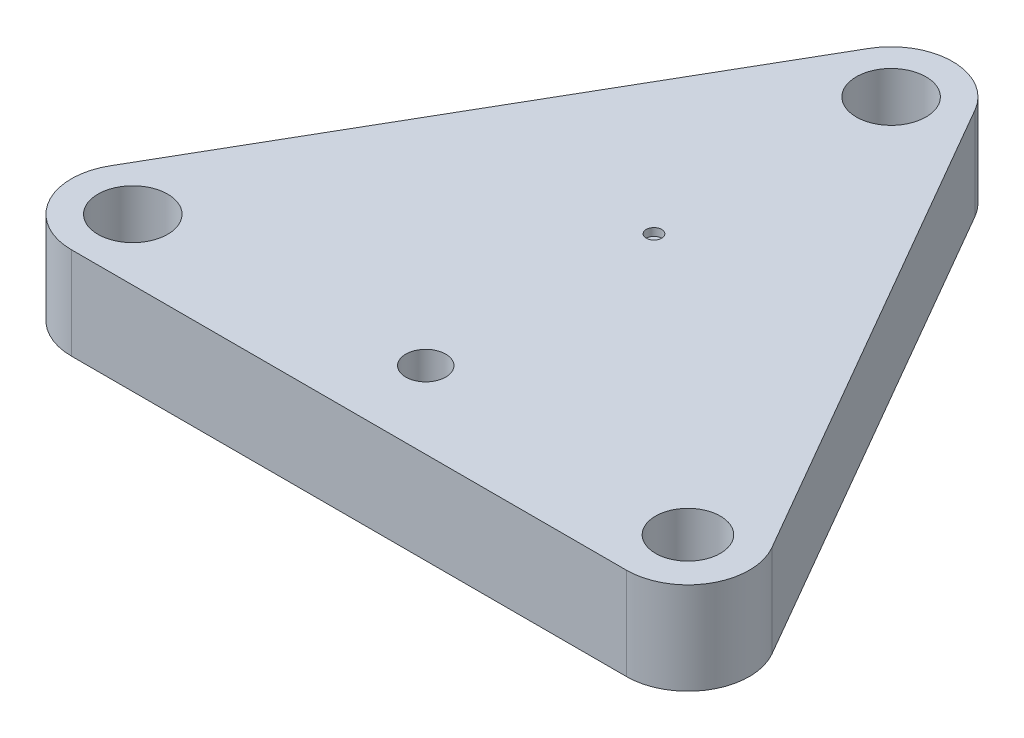
ISO-10303-21;
HEADER;
FILE_DESCRIPTION(('STEP AP214'),'2;1');
FILE_NAME('part.step','',(''),(''),'','','');
FILE_SCHEMA(('AUTOMOTIVE_DESIGN { 1 0 10303 214 1 1 1 1 }'));
ENDSEC;
DATA;
#1=APPLICATION_CONTEXT('core data for automotive mechanical design processes');
#2=APPLICATION_PROTOCOL_DEFINITION('international standard','automotive_design',2000,#1);
#3=PRODUCT_CONTEXT('',#1,'mechanical');
#4=PRODUCT('Part','Part','',(#3));
#5=PRODUCT_RELATED_PRODUCT_CATEGORY('part','',(#4));
#6=PRODUCT_DEFINITION_FORMATION('','',#4);
#7=PRODUCT_DEFINITION_CONTEXT('part definition',#1,'design');
#8=PRODUCT_DEFINITION('design','',#6,#7);
#9=PRODUCT_DEFINITION_SHAPE('','',#8);
#10=(LENGTH_UNIT() NAMED_UNIT(*) SI_UNIT(.MILLI.,.METRE.));
#11=(NAMED_UNIT(*) PLANE_ANGLE_UNIT() SI_UNIT($,.RADIAN.));
#12=(NAMED_UNIT(*) SI_UNIT($,.STERADIAN.) SOLID_ANGLE_UNIT());
#13=UNCERTAINTY_MEASURE_WITH_UNIT(LENGTH_MEASURE(1.E-05),#10,'distance_accuracy_value','');
#14=(GEOMETRIC_REPRESENTATION_CONTEXT(3) GLOBAL_UNCERTAINTY_ASSIGNED_CONTEXT((#13)) GLOBAL_UNIT_ASSIGNED_CONTEXT((#10,
#11,#12)) REPRESENTATION_CONTEXT('',''));
#15=CARTESIAN_POINT('',(0.,0.,0.));
#16=DIRECTION('',(0.,0.,1.));
#17=DIRECTION('',(1.,0.,0.));
#18=AXIS2_PLACEMENT_3D('',#15,#16,#17);
#19=CARTESIAN_POINT('',(9.0358983848623,3.,-2.));
#20=DIRECTION('',(0.,1.,0.));
#21=DIRECTION('',(0.,0.,1.));
#22=AXIS2_PLACEMENT_3D('',#19,#20,#21);
#23=PLANE('',#22);
#24=CARTESIAN_POINT('',(0.,3.,-9.93044291847072));
#25=DIRECTION('',(0.,1.,0.));
#26=DIRECTION('',(0.,0.,1.));
#27=AXIS2_PLACEMENT_3D('',#24,#25,#26);
#28=CIRCLE('',#27,0.25);
#29=CARTESIAN_POINT('',(0.,3.,-9.68044291847072));
#30=VERTEX_POINT('',#29);
#31=EDGE_CURVE('E171',#30,#30,#28,.T.);
#32=ORIENTED_EDGE('',*,*,#31,.F.);
#33=EDGE_LOOP('',(#32));
#34=FACE_BOUND('',#33,.T.);
#35=CARTESIAN_POINT('',(-4.89712808370489E-13,3.,-2.5));
#36=DIRECTION('',(0.,1.,0.));
#37=DIRECTION('',(0.,0.,1.));
#38=AXIS2_PLACEMENT_3D('',#35,#36,#37);
#39=CIRCLE('',#38,0.65);
#40=CARTESIAN_POINT('',(-4.89712808370489E-13,3.,-1.85));
#41=VERTEX_POINT('',#40);
#42=EDGE_CURVE('E165',#41,#41,#39,.T.);
#43=ORIENTED_EDGE('',*,*,#42,.F.);
#44=EDGE_LOOP('',(#43));
#45=FACE_BOUND('',#44,.T.);
#46=CARTESIAN_POINT('',(-9.03589838486223,3.,-2.));
#47=DIRECTION('',(0.,1.,0.));
#48=DIRECTION('',(0.,0.,1.));
#49=AXIS2_PLACEMENT_3D('',#46,#47,#48);
#50=CIRCLE('',#49,1.135);
#51=CARTESIAN_POINT('',(-9.03589838486223,3.,-0.864999999999998));
#52=VERTEX_POINT('',#51);
#53=EDGE_CURVE('E150',#52,#52,#50,.T.);
#54=ORIENTED_EDGE('',*,*,#53,.F.);
#55=EDGE_LOOP('',(#54));
#56=FACE_BOUND('',#55,.T.);
#57=DIRECTION('',(1.,0.,0.));
#58=VECTOR('',#57,1.);
#59=CARTESIAN_POINT('',(-9.03589838486223,3.,0.));
#60=LINE('',#59,#58);
#61=CARTESIAN_POINT('',(-9.03589838486223,3.,0.));
#62=VERTEX_POINT('',#61);
#63=CARTESIAN_POINT('',(9.03589838486229,3.,0.));
#64=VERTEX_POINT('',#63);
#65=EDGE_CURVE('E86',#62,#64,#60,.T.);
#66=ORIENTED_EDGE('',*,*,#65,.T.);
#67=CARTESIAN_POINT('',(9.0358983848623,3.,-2.));
#68=DIRECTION('',(0.,1.,0.));
#69=DIRECTION('',(0.,0.,1.));
#70=AXIS2_PLACEMENT_3D('',#67,#68,#69);
#71=CIRCLE('',#70,2.);
#72=CARTESIAN_POINT('',(10.7679491924312,3.,-2.99999999999998));
#73=VERTEX_POINT('',#72);
#74=EDGE_CURVE('E143',#64,#73,#71,.T.);
#75=ORIENTED_EDGE('',*,*,#74,.T.);
#76=DIRECTION('',(-0.499999999999991,0.,-0.866025403784444));
#77=VECTOR('',#76,1.);
#78=CARTESIAN_POINT('',(10.7679491924312,3.,-2.99999999999998));
#79=LINE('',#78,#77);
#80=CARTESIAN_POINT('',(1.73205080756907,3.,-18.6506350946111));
#81=VERTEX_POINT('',#80);
#82=EDGE_CURVE('E100',#73,#81,#79,.T.);
#83=ORIENTED_EDGE('',*,*,#82,.T.);
#84=CARTESIAN_POINT('',(1.90824453591173E-13,3.,-17.6506350946111));
#85=DIRECTION('',(0.,1.,0.));
#86=DIRECTION('',(0.,0.,1.));
#87=AXIS2_PLACEMENT_3D('',#84,#85,#86);
#88=CIRCLE('',#87,2.);
#89=CARTESIAN_POINT('',(-1.73205080756868,3.,-18.6506350946111));
#90=VERTEX_POINT('',#89);
#91=EDGE_CURVE('E94',#81,#90,#88,.T.);
#92=ORIENTED_EDGE('',*,*,#91,.T.);
#93=DIRECTION('',(-0.500000000000004,0.,0.866025403784436));
#94=VECTOR('',#93,1.);
#95=CARTESIAN_POINT('',(-1.73205080756869,3.,-18.6506350946111));
#96=LINE('',#95,#94);
#97=CARTESIAN_POINT('',(-10.7679491924311,3.,-3.00000000000001));
#98=VERTEX_POINT('',#97);
#99=EDGE_CURVE('E98',#90,#98,#96,.T.);
#100=ORIENTED_EDGE('',*,*,#99,.T.);
#101=CARTESIAN_POINT('',(-9.03589838486223,3.,-2.));
#102=DIRECTION('',(0.,1.,0.));
#103=DIRECTION('',(0.,0.,1.));
#104=AXIS2_PLACEMENT_3D('',#101,#102,#103);
#105=CIRCLE('',#104,2.);
#106=EDGE_CURVE('E50',#98,#62,#105,.T.);
#107=ORIENTED_EDGE('',*,*,#106,.T.);
#108=EDGE_LOOP('',(#66,#75,#83,#92,#100,#107));
#109=FACE_BOUND('',#108,.T.);
#110=CARTESIAN_POINT('',(1.90824453591173E-13,3.,-17.6506350946111));
#111=DIRECTION('',(0.,1.,0.));
#112=DIRECTION('',(0.,0.,1.));
#113=AXIS2_PLACEMENT_3D('',#110,#111,#112);
#114=CIRCLE('',#113,1.135);
#115=CARTESIAN_POINT('',(1.90824453591173E-13,3.,-16.5156350946111));
#116=VERTEX_POINT('',#115);
#117=EDGE_CURVE('E120',#116,#116,#114,.T.);
#118=ORIENTED_EDGE('',*,*,#117,.F.);
#119=EDGE_LOOP('',(#118));
#120=FACE_BOUND('',#119,.T.);
#121=CARTESIAN_POINT('',(9.0358983848623,3.,-2.));
#122=DIRECTION('',(0.,1.,0.));
#123=DIRECTION('',(0.,0.,1.));
#124=AXIS2_PLACEMENT_3D('',#121,#122,#123);
#125=CIRCLE('',#124,1.054);
#126=CARTESIAN_POINT('',(9.0358983848623,3.,-0.946));
#127=VERTEX_POINT('',#126);
#128=EDGE_CURVE('E156',#127,#127,#125,.T.);
#129=ORIENTED_EDGE('',*,*,#128,.F.);
#130=EDGE_LOOP('',(#129));
#131=FACE_BOUND('',#130,.T.);
#132=ADVANCED_FACE('F33',(#34,#45,#56,#109,#120,#131),#23,.T.);
#133=CARTESIAN_POINT('',(9.0358983848623,0.,-2.));
#134=DIRECTION('',(0.,1.,0.));
#135=DIRECTION('',(0.,0.,1.));
#136=AXIS2_PLACEMENT_3D('',#133,#134,#135);
#137=PLANE('',#136);
#138=CARTESIAN_POINT('',(-4.89712808370489E-13,0.,-2.5));
#139=DIRECTION('',(0.,1.,0.));
#140=DIRECTION('',(0.,0.,1.));
#141=AXIS2_PLACEMENT_3D('',#138,#139,#140);
#142=CIRCLE('',#141,0.65);
#143=CARTESIAN_POINT('',(-4.89712808370489E-13,0.,-1.85));
#144=VERTEX_POINT('',#143);
#145=EDGE_CURVE('E162',#144,#144,#142,.T.);
#146=ORIENTED_EDGE('',*,*,#145,.T.);
#147=EDGE_LOOP('',(#146));
#148=FACE_BOUND('',#147,.T.);
#149=CARTESIAN_POINT('',(-9.03589838486223,0.,-2.));
#150=DIRECTION('',(0.,1.,0.));
#151=DIRECTION('',(0.,0.,1.));
#152=AXIS2_PLACEMENT_3D('',#149,#150,#151);
#153=CIRCLE('',#152,1.135);
#154=CARTESIAN_POINT('',(-9.03589838486223,0.,-0.864999999999998));
#155=VERTEX_POINT('',#154);
#156=EDGE_CURVE('E153',#155,#155,#153,.T.);
#157=ORIENTED_EDGE('',*,*,#156,.T.);
#158=EDGE_LOOP('',(#157));
#159=FACE_BOUND('',#158,.T.);
#160=DIRECTION('',(1.,0.,0.));
#161=VECTOR('',#160,1.);
#162=CARTESIAN_POINT('',(0.,0.,0.));
#163=LINE('',#162,#161);
#164=CARTESIAN_POINT('',(-9.03589838486223,0.,0.));
#165=VERTEX_POINT('',#164);
#166=CARTESIAN_POINT('',(9.03589838486229,0.,0.));
#167=VERTEX_POINT('',#166);
#168=EDGE_CURVE('E80',#165,#167,#163,.T.);
#169=ORIENTED_EDGE('',*,*,#168,.F.);
#170=CARTESIAN_POINT('',(-9.03589838486223,0.,-2.));
#171=DIRECTION('',(0.,1.,0.));
#172=DIRECTION('',(0.,0.,1.));
#173=AXIS2_PLACEMENT_3D('',#170,#171,#172);
#174=CIRCLE('',#173,2.);
#175=CARTESIAN_POINT('',(-10.7679491924311,0.,-3.00000000000001));
#176=VERTEX_POINT('',#175);
#177=EDGE_CURVE('E126',#176,#165,#174,.T.);
#178=ORIENTED_EDGE('',*,*,#177,.F.);
#179=DIRECTION('',(-0.500000000000004,0.,0.866025403784436));
#180=VECTOR('',#179,1.);
#181=CARTESIAN_POINT('',(-1.73205080756869,0.,-18.6506350946111));
#182=LINE('',#181,#180);
#183=CARTESIAN_POINT('',(-1.73205080756868,0.,-18.6506350946111));
#184=VERTEX_POINT('',#183);
#185=EDGE_CURVE('E73',#184,#176,#182,.T.);
#186=ORIENTED_EDGE('',*,*,#185,.F.);
#187=CARTESIAN_POINT('',(1.90824453591173E-13,0.,-17.6506350946111));
#188=DIRECTION('',(0.,1.,0.));
#189=DIRECTION('',(0.,0.,1.));
#190=AXIS2_PLACEMENT_3D('',#187,#188,#189);
#191=CIRCLE('',#190,2.);
#192=CARTESIAN_POINT('',(1.73205080756907,0.,-18.6506350946111));
#193=VERTEX_POINT('',#192);
#194=EDGE_CURVE('E108',#193,#184,#191,.T.);
#195=ORIENTED_EDGE('',*,*,#194,.F.);
#196=DIRECTION('',(-0.499999999999991,0.,-0.866025403784444));
#197=VECTOR('',#196,1.);
#198=CARTESIAN_POINT('',(10.7679491924312,0.,-2.99999999999998));
#199=LINE('',#198,#197);
#200=CARTESIAN_POINT('',(10.7679491924312,0.,-2.99999999999998));
#201=VERTEX_POINT('',#200);
#202=EDGE_CURVE('E122',#201,#193,#199,.T.);
#203=ORIENTED_EDGE('',*,*,#202,.F.);
#204=CARTESIAN_POINT('',(9.0358983848623,0.,-2.));
#205=DIRECTION('',(0.,1.,0.));
#206=DIRECTION('',(0.,0.,1.));
#207=AXIS2_PLACEMENT_3D('',#204,#205,#206);
#208=CIRCLE('',#207,2.);
#209=EDGE_CURVE('E119',#167,#201,#208,.T.);
#210=ORIENTED_EDGE('',*,*,#209,.F.);
#211=EDGE_LOOP('',(#169,#178,#186,#195,#203,#210));
#212=FACE_BOUND('',#211,.T.);
#213=CARTESIAN_POINT('',(1.90824453591173E-13,0.,-17.6506350946111));
#214=DIRECTION('',(0.,1.,0.));
#215=DIRECTION('',(0.,0.,1.));
#216=AXIS2_PLACEMENT_3D('',#213,#214,#215);
#217=CIRCLE('',#216,1.135);
#218=CARTESIAN_POINT('',(1.90824453591173E-13,0.,-16.5156350946111));
#219=VERTEX_POINT('',#218);
#220=EDGE_CURVE('E147',#219,#219,#217,.T.);
#221=ORIENTED_EDGE('',*,*,#220,.T.);
#222=EDGE_LOOP('',(#221));
#223=FACE_BOUND('',#222,.T.);
#224=CARTESIAN_POINT('',(9.0358983848623,0.,-2.));
#225=DIRECTION('',(0.,1.,0.));
#226=DIRECTION('',(0.,0.,1.));
#227=AXIS2_PLACEMENT_3D('',#224,#225,#226);
#228=CIRCLE('',#227,1.054);
#229=CARTESIAN_POINT('',(9.0358983848623,0.,-0.946));
#230=VERTEX_POINT('',#229);
#231=EDGE_CURVE('E159',#230,#230,#228,.T.);
#232=ORIENTED_EDGE('',*,*,#231,.T.);
#233=EDGE_LOOP('',(#232));
#234=FACE_BOUND('',#233,.T.);
#235=ADVANCED_FACE('F138',(#148,#159,#212,#223,#234),#137,.F.);
#236=CARTESIAN_POINT('',(0.,3.,0.));
#237=DIRECTION('',(0.,0.,-1.));
#238=DIRECTION('',(-1.,0.,0.));
#239=AXIS2_PLACEMENT_3D('',#236,#237,#238);
#240=PLANE('',#239);
#241=ORIENTED_EDGE('',*,*,#168,.T.);
#242=DIRECTION('',(0.,-1.,0.));
#243=VECTOR('',#242,1.);
#244=CARTESIAN_POINT('',(9.03589838486229,3.,0.));
#245=LINE('',#244,#243);
#246=EDGE_CURVE('E11',#64,#167,#245,.T.);
#247=ORIENTED_EDGE('',*,*,#246,.F.);
#248=ORIENTED_EDGE('',*,*,#65,.F.);
#249=DIRECTION('',(0.,-1.,0.));
#250=VECTOR('',#249,1.);
#251=CARTESIAN_POINT('',(-9.03589838486223,3.,0.));
#252=LINE('',#251,#250);
#253=EDGE_CURVE('E114',#62,#165,#252,.T.);
#254=ORIENTED_EDGE('',*,*,#253,.T.);
#255=EDGE_LOOP('',(#241,#247,#248,#254));
#256=FACE_BOUND('',#255,.T.);
#257=ADVANCED_FACE('F35',(#256),#240,.F.);
#258=CARTESIAN_POINT('',(9.0358983848623,3.,-2.));
#259=DIRECTION('',(0.,-1.,0.));
#260=DIRECTION('',(0.,0.,-1.));
#261=AXIS2_PLACEMENT_3D('',#258,#259,#260);
#262=CYLINDRICAL_SURFACE('',#261,2.);
#263=ORIENTED_EDGE('',*,*,#209,.T.);
#264=DIRECTION('',(0.,-1.,0.));
#265=VECTOR('',#264,1.);
#266=CARTESIAN_POINT('',(10.7679491924312,3.,-2.99999999999998));
#267=LINE('',#266,#265);
#268=EDGE_CURVE('E42',#73,#201,#267,.T.);
#269=ORIENTED_EDGE('',*,*,#268,.F.);
#270=ORIENTED_EDGE('',*,*,#74,.F.);
#271=ORIENTED_EDGE('',*,*,#246,.T.);
#272=EDGE_LOOP('',(#263,#269,#270,#271));
#273=FACE_BOUND('',#272,.T.);
#274=ADVANCED_FACE('F207',(#273),#262,.T.);
#275=CARTESIAN_POINT('',(10.7679491924312,3.,-2.99999999999998));
#276=DIRECTION('',(-0.866025403784444,0.,0.499999999999991));
#277=DIRECTION('',(0.499999999999991,0.,0.866025403784444));
#278=AXIS2_PLACEMENT_3D('',#275,#276,#277);
#279=PLANE('',#278);
#280=ORIENTED_EDGE('',*,*,#202,.T.);
#281=DIRECTION('',(0.,-1.,0.));
#282=VECTOR('',#281,1.);
#283=CARTESIAN_POINT('',(1.73205080756907,3.,-18.6506350946111));
#284=LINE('',#283,#282);
#285=EDGE_CURVE('E109',#81,#193,#284,.T.);
#286=ORIENTED_EDGE('',*,*,#285,.F.);
#287=ORIENTED_EDGE('',*,*,#82,.F.);
#288=ORIENTED_EDGE('',*,*,#268,.T.);
#289=EDGE_LOOP('',(#280,#286,#287,#288));
#290=FACE_BOUND('',#289,.T.);
#291=ADVANCED_FACE('F135',(#290),#279,.F.);
#292=CARTESIAN_POINT('',(1.90824453591173E-13,3.,-17.6506350946111));
#293=DIRECTION('',(0.,-1.,0.));
#294=DIRECTION('',(0.,0.,-1.));
#295=AXIS2_PLACEMENT_3D('',#292,#293,#294);
#296=CYLINDRICAL_SURFACE('',#295,2.);
#297=ORIENTED_EDGE('',*,*,#194,.T.);
#298=DIRECTION('',(0.,-1.,0.));
#299=VECTOR('',#298,1.);
#300=CARTESIAN_POINT('',(-1.73205080756868,3.,-18.6506350946111));
#301=LINE('',#300,#299);
#302=EDGE_CURVE('E105',#90,#184,#301,.T.);
#303=ORIENTED_EDGE('',*,*,#302,.F.);
#304=ORIENTED_EDGE('',*,*,#91,.F.);
#305=ORIENTED_EDGE('',*,*,#285,.T.);
#306=EDGE_LOOP('',(#297,#303,#304,#305));
#307=FACE_BOUND('',#306,.T.);
#308=ADVANCED_FACE('F106',(#307),#296,.T.);
#309=CARTESIAN_POINT('',(-1.73205080756869,3.,-18.6506350946111));
#310=DIRECTION('',(0.866025403784436,0.,0.500000000000004));
#311=DIRECTION('',(0.500000000000004,0.,-0.866025403784436));
#312=AXIS2_PLACEMENT_3D('',#309,#310,#311);
#313=PLANE('',#312);
#314=ORIENTED_EDGE('',*,*,#185,.T.);
#315=DIRECTION('',(0.,-1.,0.));
#316=VECTOR('',#315,1.);
#317=CARTESIAN_POINT('',(-10.7679491924311,3.,-3.00000000000001));
#318=LINE('',#317,#316);
#319=EDGE_CURVE('E110',#98,#176,#318,.T.);
#320=ORIENTED_EDGE('',*,*,#319,.F.);
#321=ORIENTED_EDGE('',*,*,#99,.F.);
#322=ORIENTED_EDGE('',*,*,#302,.T.);
#323=EDGE_LOOP('',(#314,#320,#321,#322));
#324=FACE_BOUND('',#323,.T.);
#325=ADVANCED_FACE('F112',(#324),#313,.F.);
#326=CARTESIAN_POINT('',(-9.03589838486223,3.,-2.));
#327=DIRECTION('',(0.,-1.,0.));
#328=DIRECTION('',(0.,0.,-1.));
#329=AXIS2_PLACEMENT_3D('',#326,#327,#328);
#330=CYLINDRICAL_SURFACE('',#329,2.);
#331=ORIENTED_EDGE('',*,*,#177,.T.);
#332=ORIENTED_EDGE('',*,*,#253,.F.);
#333=ORIENTED_EDGE('',*,*,#106,.F.);
#334=ORIENTED_EDGE('',*,*,#319,.T.);
#335=EDGE_LOOP('',(#331,#332,#333,#334));
#336=FACE_BOUND('',#335,.T.);
#337=ADVANCED_FACE('F141',(#336),#330,.T.);
#338=CARTESIAN_POINT('',(1.90824453591173E-13,3.,-17.6506350946111));
#339=DIRECTION('',(0.,-1.,0.));
#340=DIRECTION('',(0.,0.,-1.));
#341=AXIS2_PLACEMENT_3D('',#338,#339,#340);
#342=CYLINDRICAL_SURFACE('',#341,1.135);
#343=ORIENTED_EDGE('',*,*,#117,.T.);
#344=EDGE_LOOP('',(#343));
#345=FACE_BOUND('',#344,.T.);
#346=ORIENTED_EDGE('',*,*,#220,.F.);
#347=EDGE_LOOP('',(#346));
#348=FACE_BOUND('',#347,.T.);
#349=ADVANCED_FACE('F197',(#345,#348),#342,.F.);
#350=CARTESIAN_POINT('',(-9.03589838486223,3.,-2.));
#351=DIRECTION('',(0.,-1.,0.));
#352=DIRECTION('',(0.,0.,-1.));
#353=AXIS2_PLACEMENT_3D('',#350,#351,#352);
#354=CYLINDRICAL_SURFACE('',#353,1.135);
#355=ORIENTED_EDGE('',*,*,#53,.T.);
#356=EDGE_LOOP('',(#355));
#357=FACE_BOUND('',#356,.T.);
#358=ORIENTED_EDGE('',*,*,#156,.F.);
#359=EDGE_LOOP('',(#358));
#360=FACE_BOUND('',#359,.T.);
#361=ADVANCED_FACE('F193',(#357,#360),#354,.F.);
#362=CARTESIAN_POINT('',(9.0358983848623,3.,-2.));
#363=DIRECTION('',(0.,-1.,0.));
#364=DIRECTION('',(0.,0.,-1.));
#365=AXIS2_PLACEMENT_3D('',#362,#363,#364);
#366=CYLINDRICAL_SURFACE('',#365,1.054);
#367=ORIENTED_EDGE('',*,*,#128,.T.);
#368=EDGE_LOOP('',(#367));
#369=FACE_BOUND('',#368,.T.);
#370=ORIENTED_EDGE('',*,*,#231,.F.);
#371=EDGE_LOOP('',(#370));
#372=FACE_BOUND('',#371,.T.);
#373=ADVANCED_FACE('F196',(#369,#372),#366,.F.);
#374=CARTESIAN_POINT('',(-4.89712808370489E-13,0.,-2.5));
#375=DIRECTION('',(0.,1.,0.));
#376=DIRECTION('',(0.,0.,1.));
#377=AXIS2_PLACEMENT_3D('',#374,#375,#376);
#378=CYLINDRICAL_SURFACE('',#377,0.65);
#379=ORIENTED_EDGE('',*,*,#145,.F.);
#380=EDGE_LOOP('',(#379));
#381=FACE_BOUND('',#380,.T.);
#382=ORIENTED_EDGE('',*,*,#42,.T.);
#383=EDGE_LOOP('',(#382));
#384=FACE_BOUND('',#383,.T.);
#385=ADVANCED_FACE('F182',(#381,#384),#378,.F.);
#386=CARTESIAN_POINT('',(0.,2.75,-9.93044291847072));
#387=DIRECTION('',(0.,1.,0.));
#388=DIRECTION('',(0.,0.,1.));
#389=AXIS2_PLACEMENT_3D('',#386,#387,#388);
#390=CYLINDRICAL_SURFACE('',#389,0.25);
#391=CARTESIAN_POINT('',(0.,2.75,-9.93044291847072));
#392=DIRECTION('',(0.,1.,0.));
#393=DIRECTION('',(0.,0.,1.));
#394=AXIS2_PLACEMENT_3D('',#391,#392,#393);
#395=CIRCLE('',#394,0.25);
#396=CARTESIAN_POINT('',(0.,2.75,-9.68044291847072));
#397=VERTEX_POINT('',#396);
#398=EDGE_CURVE('E168',#397,#397,#395,.T.);
#399=ORIENTED_EDGE('',*,*,#398,.F.);
#400=EDGE_LOOP('',(#399));
#401=FACE_BOUND('',#400,.T.);
#402=ORIENTED_EDGE('',*,*,#31,.T.);
#403=EDGE_LOOP('',(#402));
#404=FACE_BOUND('',#403,.T.);
#405=ADVANCED_FACE('F179',(#401,#404),#390,.F.);
#406=CARTESIAN_POINT('',(0.,2.75,-9.93044291847072));
#407=DIRECTION('',(0.,1.,0.));
#408=DIRECTION('',(0.,0.,1.));
#409=AXIS2_PLACEMENT_3D('',#406,#407,#408);
#410=PLANE('',#409);
#411=ORIENTED_EDGE('',*,*,#398,.T.);
#412=EDGE_LOOP('',(#411));
#413=FACE_BOUND('',#412,.T.);
#414=ADVANCED_FACE('F177',(#413),#410,.T.);
#415=CLOSED_SHELL('',(#132,#235,#257,#274,#291,#308,#325,#337,#349,#361,#373,#385,#405,#414));
#416=MANIFOLD_SOLID_BREP('B2',#415);
#417=ADVANCED_BREP_SHAPE_REPRESENTATION('',(#18,#416),#14);
#418=SHAPE_DEFINITION_REPRESENTATION(#9,#417);
ENDSEC;
END-ISO-10303-21;
